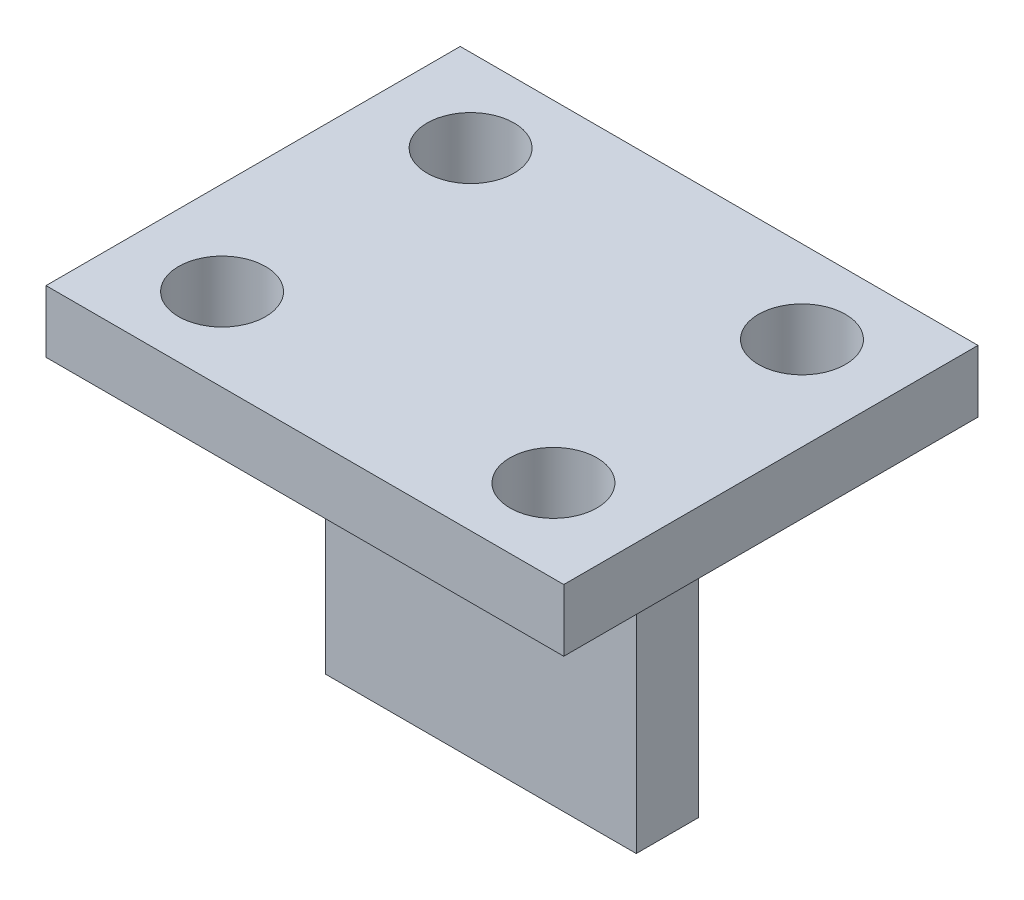
ISO-10303-21;
HEADER;
FILE_DESCRIPTION(('STEP AP214'),'2;1');
FILE_NAME('part.step','',(''),(''),'','','');
FILE_SCHEMA(('AUTOMOTIVE_DESIGN { 1 0 10303 214 1 1 1 1 }'));
ENDSEC;
DATA;
#1=APPLICATION_CONTEXT('core data for automotive mechanical design processes');
#2=APPLICATION_PROTOCOL_DEFINITION('international standard','automotive_design',2000,#1);
#3=PRODUCT_CONTEXT('',#1,'mechanical');
#4=PRODUCT('Part','Part','',(#3));
#5=PRODUCT_RELATED_PRODUCT_CATEGORY('part','',(#4));
#6=PRODUCT_DEFINITION_FORMATION('','',#4);
#7=PRODUCT_DEFINITION_CONTEXT('part definition',#1,'design');
#8=PRODUCT_DEFINITION('design','',#6,#7);
#9=PRODUCT_DEFINITION_SHAPE('','',#8);
#10=(LENGTH_UNIT() NAMED_UNIT(*) SI_UNIT(.MILLI.,.METRE.));
#11=(NAMED_UNIT(*) PLANE_ANGLE_UNIT() SI_UNIT($,.RADIAN.));
#12=(NAMED_UNIT(*) SI_UNIT($,.STERADIAN.) SOLID_ANGLE_UNIT());
#13=UNCERTAINTY_MEASURE_WITH_UNIT(LENGTH_MEASURE(1.E-05),#10,'distance_accuracy_value','');
#14=(GEOMETRIC_REPRESENTATION_CONTEXT(3) GLOBAL_UNCERTAINTY_ASSIGNED_CONTEXT((#13)) GLOBAL_UNIT_ASSIGNED_CONTEXT((#10,
#11,#12)) REPRESENTATION_CONTEXT('',''));
#15=CARTESIAN_POINT('',(0.,0.,0.));
#16=DIRECTION('',(0.,0.,1.));
#17=DIRECTION('',(1.,0.,0.));
#18=AXIS2_PLACEMENT_3D('',#15,#16,#17);
#19=CARTESIAN_POINT('',(12.5,1.5,10.));
#20=DIRECTION('',(-1.,0.,0.));
#21=DIRECTION('',(0.,0.,1.));
#22=AXIS2_PLACEMENT_3D('',#19,#20,#21);
#23=PLANE('',#22);
#24=DIRECTION('',(0.,0.,-1.));
#25=VECTOR('',#24,1.);
#26=CARTESIAN_POINT('',(12.5,-1.5,10.));
#27=LINE('',#26,#25);
#28=CARTESIAN_POINT('',(12.5,-1.5,10.));
#29=VERTEX_POINT('',#28);
#30=CARTESIAN_POINT('',(12.5,-1.5,-10.));
#31=VERTEX_POINT('',#30);
#32=EDGE_CURVE('E120',#29,#31,#27,.T.);
#33=ORIENTED_EDGE('',*,*,#32,.T.);
#34=DIRECTION('',(0.,-1.,0.));
#35=VECTOR('',#34,1.);
#36=CARTESIAN_POINT('',(12.5,1.5,-10.));
#37=LINE('',#36,#35);
#38=CARTESIAN_POINT('',(12.5,1.5,-10.));
#39=VERTEX_POINT('',#38);
#40=EDGE_CURVE('E11',#39,#31,#37,.T.);
#41=ORIENTED_EDGE('',*,*,#40,.F.);
#42=DIRECTION('',(0.,0.,-1.));
#43=VECTOR('',#42,1.);
#44=CARTESIAN_POINT('',(12.5,1.5,10.));
#45=LINE('',#44,#43);
#46=CARTESIAN_POINT('',(12.5,1.5,10.));
#47=VERTEX_POINT('',#46);
#48=EDGE_CURVE('E129',#47,#39,#45,.T.);
#49=ORIENTED_EDGE('',*,*,#48,.F.);
#50=DIRECTION('',(0.,-1.,0.));
#51=VECTOR('',#50,1.);
#52=CARTESIAN_POINT('',(12.5,1.5,10.));
#53=LINE('',#52,#51);
#54=EDGE_CURVE('E138',#47,#29,#53,.T.);
#55=ORIENTED_EDGE('',*,*,#54,.T.);
#56=EDGE_LOOP('',(#33,#41,#49,#55));
#57=FACE_BOUND('',#56,.T.);
#58=ADVANCED_FACE('F36',(#57),#23,.F.);
#59=CARTESIAN_POINT('',(-12.5,1.5,-10.));
#60=DIRECTION('',(0.,0.,1.));
#61=DIRECTION('',(1.,0.,0.));
#62=AXIS2_PLACEMENT_3D('',#59,#60,#61);
#63=PLANE('',#62);
#64=DIRECTION('',(-1.,0.,0.));
#65=VECTOR('',#64,1.);
#66=CARTESIAN_POINT('',(-12.5,-1.5,-10.));
#67=LINE('',#66,#65);
#68=CARTESIAN_POINT('',(-12.5,-1.5,-10.));
#69=VERTEX_POINT('',#68);
#70=EDGE_CURVE('E123',#31,#69,#67,.T.);
#71=ORIENTED_EDGE('',*,*,#70,.T.);
#72=DIRECTION('',(0.,-1.,0.));
#73=VECTOR('',#72,1.);
#74=CARTESIAN_POINT('',(-12.5,1.5,-10.));
#75=LINE('',#74,#73);
#76=CARTESIAN_POINT('',(-12.5,1.5,-10.));
#77=VERTEX_POINT('',#76);
#78=EDGE_CURVE('E43',#77,#69,#75,.T.);
#79=ORIENTED_EDGE('',*,*,#78,.F.);
#80=DIRECTION('',(-1.,0.,0.));
#81=VECTOR('',#80,1.);
#82=CARTESIAN_POINT('',(-12.5,1.5,-10.));
#83=LINE('',#82,#81);
#84=EDGE_CURVE('E132',#39,#77,#83,.T.);
#85=ORIENTED_EDGE('',*,*,#84,.F.);
#86=ORIENTED_EDGE('',*,*,#40,.T.);
#87=EDGE_LOOP('',(#71,#79,#85,#86));
#88=FACE_BOUND('',#87,.T.);
#89=ADVANCED_FACE('F169',(#88),#63,.F.);
#90=CARTESIAN_POINT('',(-12.5,1.5,10.));
#91=DIRECTION('',(1.,0.,0.));
#92=DIRECTION('',(0.,0.,-1.));
#93=AXIS2_PLACEMENT_3D('',#90,#91,#92);
#94=PLANE('',#93);
#95=DIRECTION('',(0.,0.,1.));
#96=VECTOR('',#95,1.);
#97=CARTESIAN_POINT('',(-12.5,-1.5,10.));
#98=LINE('',#97,#96);
#99=CARTESIAN_POINT('',(-12.5,-1.5,10.));
#100=VERTEX_POINT('',#99);
#101=EDGE_CURVE('E141',#69,#100,#98,.T.);
#102=ORIENTED_EDGE('',*,*,#101,.T.);
#103=DIRECTION('',(0.,-1.,0.));
#104=VECTOR('',#103,1.);
#105=CARTESIAN_POINT('',(-12.5,1.5,10.));
#106=LINE('',#105,#104);
#107=CARTESIAN_POINT('',(-12.5,1.5,10.));
#108=VERTEX_POINT('',#107);
#109=EDGE_CURVE('E146',#108,#100,#106,.T.);
#110=ORIENTED_EDGE('',*,*,#109,.F.);
#111=DIRECTION('',(0.,0.,1.));
#112=VECTOR('',#111,1.);
#113=CARTESIAN_POINT('',(-12.5,1.5,10.));
#114=LINE('',#113,#112);
#115=EDGE_CURVE('E135',#77,#108,#114,.T.);
#116=ORIENTED_EDGE('',*,*,#115,.F.);
#117=ORIENTED_EDGE('',*,*,#78,.T.);
#118=EDGE_LOOP('',(#102,#110,#116,#117));
#119=FACE_BOUND('',#118,.T.);
#120=ADVANCED_FACE('F153',(#119),#94,.F.);
#121=CARTESIAN_POINT('',(-12.5,1.5,10.));
#122=DIRECTION('',(0.,0.,-1.));
#123=DIRECTION('',(-1.,0.,0.));
#124=AXIS2_PLACEMENT_3D('',#121,#122,#123);
#125=PLANE('',#124);
#126=DIRECTION('',(1.,0.,0.));
#127=VECTOR('',#126,1.);
#128=CARTESIAN_POINT('',(-12.5,-1.5,10.));
#129=LINE('',#128,#127);
#130=EDGE_CURVE('E133',#100,#29,#129,.T.);
#131=ORIENTED_EDGE('',*,*,#130,.T.);
#132=ORIENTED_EDGE('',*,*,#54,.F.);
#133=DIRECTION('',(1.,0.,0.));
#134=VECTOR('',#133,1.);
#135=CARTESIAN_POINT('',(-12.5,1.5,10.));
#136=LINE('',#135,#134);
#137=EDGE_CURVE('E137',#108,#47,#136,.T.);
#138=ORIENTED_EDGE('',*,*,#137,.F.);
#139=ORIENTED_EDGE('',*,*,#109,.T.);
#140=EDGE_LOOP('',(#131,#132,#138,#139));
#141=FACE_BOUND('',#140,.T.);
#142=ADVANCED_FACE('F162',(#141),#125,.F.);
#143=CARTESIAN_POINT('',(0.,1.5,0.));
#144=DIRECTION('',(0.,-1.,0.));
#145=DIRECTION('',(0.,0.,-1.));
#146=AXIS2_PLACEMENT_3D('',#143,#144,#145);
#147=PLANE('',#146);
#148=CARTESIAN_POINT('',(-8.,1.5,6.));
#149=DIRECTION('',(0.,-1.,0.));
#150=DIRECTION('',(0.,0.,-1.));
#151=AXIS2_PLACEMENT_3D('',#148,#149,#150);
#152=CIRCLE('',#151,2.1);
#153=CARTESIAN_POINT('',(-8.,1.5,3.9));
#154=VERTEX_POINT('',#153);
#155=EDGE_CURVE('E228',#154,#154,#152,.F.);
#156=ORIENTED_EDGE('',*,*,#155,.F.);
#157=EDGE_LOOP('',(#156));
#158=FACE_BOUND('',#157,.T.);
#159=CARTESIAN_POINT('',(8.,1.5,6.));
#160=DIRECTION('',(0.,-1.,0.));
#161=DIRECTION('',(0.,0.,-1.));
#162=AXIS2_PLACEMENT_3D('',#159,#160,#161);
#163=CIRCLE('',#162,2.1);
#164=CARTESIAN_POINT('',(8.,1.5,3.9));
#165=VERTEX_POINT('',#164);
#166=EDGE_CURVE('E224',#165,#165,#163,.F.);
#167=ORIENTED_EDGE('',*,*,#166,.F.);
#168=EDGE_LOOP('',(#167));
#169=FACE_BOUND('',#168,.T.);
#170=CARTESIAN_POINT('',(8.,1.5,-6.));
#171=DIRECTION('',(0.,-1.,0.));
#172=DIRECTION('',(0.,0.,-1.));
#173=AXIS2_PLACEMENT_3D('',#170,#171,#172);
#174=CIRCLE('',#173,2.1);
#175=CARTESIAN_POINT('',(8.,1.5,-8.1));
#176=VERTEX_POINT('',#175);
#177=EDGE_CURVE('E222',#176,#176,#174,.F.);
#178=ORIENTED_EDGE('',*,*,#177,.F.);
#179=EDGE_LOOP('',(#178));
#180=FACE_BOUND('',#179,.T.);
#181=CARTESIAN_POINT('',(-8.,1.5,-6.));
#182=DIRECTION('',(0.,-1.,0.));
#183=DIRECTION('',(0.,0.,-1.));
#184=AXIS2_PLACEMENT_3D('',#181,#182,#183);
#185=CIRCLE('',#184,2.1);
#186=CARTESIAN_POINT('',(-8.,1.5,-8.1));
#187=VERTEX_POINT('',#186);
#188=EDGE_CURVE('E225',#187,#187,#185,.F.);
#189=ORIENTED_EDGE('',*,*,#188,.F.);
#190=EDGE_LOOP('',(#189));
#191=FACE_BOUND('',#190,.T.);
#192=ORIENTED_EDGE('',*,*,#48,.T.);
#193=ORIENTED_EDGE('',*,*,#84,.T.);
#194=ORIENTED_EDGE('',*,*,#115,.T.);
#195=ORIENTED_EDGE('',*,*,#137,.T.);
#196=EDGE_LOOP('',(#192,#193,#194,#195));
#197=FACE_BOUND('',#196,.T.);
#198=ADVANCED_FACE('F168',(#158,#169,#180,#191,#197),#147,.F.);
#199=CARTESIAN_POINT('',(0.,-1.5,0.));
#200=DIRECTION('',(0.,-1.,0.));
#201=DIRECTION('',(0.,0.,-1.));
#202=AXIS2_PLACEMENT_3D('',#199,#200,#201);
#203=PLANE('',#202);
#204=CARTESIAN_POINT('',(-8.,-1.5,6.));
#205=DIRECTION('',(0.,-1.,0.));
#206=DIRECTION('',(0.,0.,-1.));
#207=AXIS2_PLACEMENT_3D('',#204,#205,#206);
#208=CIRCLE('',#207,2.1);
#209=CARTESIAN_POINT('',(-8.,-1.5,3.9));
#210=VERTEX_POINT('',#209);
#211=EDGE_CURVE('E258',#210,#210,#208,.F.);
#212=ORIENTED_EDGE('',*,*,#211,.T.);
#213=EDGE_LOOP('',(#212));
#214=FACE_BOUND('',#213,.T.);
#215=CARTESIAN_POINT('',(8.,-1.5,6.));
#216=DIRECTION('',(0.,-1.,0.));
#217=DIRECTION('',(0.,0.,-1.));
#218=AXIS2_PLACEMENT_3D('',#215,#216,#217);
#219=CIRCLE('',#218,2.1);
#220=CARTESIAN_POINT('',(8.,-1.5,3.9));
#221=VERTEX_POINT('',#220);
#222=EDGE_CURVE('E261',#221,#221,#219,.F.);
#223=ORIENTED_EDGE('',*,*,#222,.T.);
#224=EDGE_LOOP('',(#223));
#225=FACE_BOUND('',#224,.T.);
#226=CARTESIAN_POINT('',(8.,-1.5,-6.));
#227=DIRECTION('',(0.,-1.,0.));
#228=DIRECTION('',(0.,0.,-1.));
#229=AXIS2_PLACEMENT_3D('',#226,#227,#228);
#230=CIRCLE('',#229,2.1);
#231=CARTESIAN_POINT('',(8.,-1.5,-8.1));
#232=VERTEX_POINT('',#231);
#233=EDGE_CURVE('E219',#232,#232,#230,.F.);
#234=ORIENTED_EDGE('',*,*,#233,.T.);
#235=EDGE_LOOP('',(#234));
#236=FACE_BOUND('',#235,.T.);
#237=CARTESIAN_POINT('',(-8.,-1.5,-6.));
#238=DIRECTION('',(0.,-1.,0.));
#239=DIRECTION('',(0.,0.,-1.));
#240=AXIS2_PLACEMENT_3D('',#237,#238,#239);
#241=CIRCLE('',#240,2.1);
#242=CARTESIAN_POINT('',(-8.,-1.5,-8.1));
#243=VERTEX_POINT('',#242);
#244=EDGE_CURVE('E231',#243,#243,#241,.F.);
#245=ORIENTED_EDGE('',*,*,#244,.T.);
#246=EDGE_LOOP('',(#245));
#247=FACE_BOUND('',#246,.T.);
#248=DIRECTION('',(0.,0.,1.));
#249=VECTOR('',#248,1.);
#250=CARTESIAN_POINT('',(7.5,-1.5,-1.5));
#251=LINE('',#250,#249);
#252=CARTESIAN_POINT('',(7.5,-1.5,-1.5));
#253=VERTEX_POINT('',#252);
#254=CARTESIAN_POINT('',(7.5,-1.5,1.5));
#255=VERTEX_POINT('',#254);
#256=EDGE_CURVE('E50',#253,#255,#251,.T.);
#257=ORIENTED_EDGE('',*,*,#256,.F.);
#258=DIRECTION('',(1.,0.,0.));
#259=VECTOR('',#258,1.);
#260=CARTESIAN_POINT('',(-7.5,-1.5,-1.5));
#261=LINE('',#260,#259);
#262=CARTESIAN_POINT('',(-7.5,-1.5,-1.5));
#263=VERTEX_POINT('',#262);
#264=EDGE_CURVE('E54',#263,#253,#261,.T.);
#265=ORIENTED_EDGE('',*,*,#264,.F.);
#266=DIRECTION('',(0.,0.,-1.));
#267=VECTOR('',#266,1.);
#268=CARTESIAN_POINT('',(-7.5,-1.5,-1.5));
#269=LINE('',#268,#267);
#270=CARTESIAN_POINT('',(-7.5,-1.5,1.5));
#271=VERTEX_POINT('',#270);
#272=EDGE_CURVE('E243',#271,#263,#269,.T.);
#273=ORIENTED_EDGE('',*,*,#272,.F.);
#274=DIRECTION('',(-1.,0.,0.));
#275=VECTOR('',#274,1.);
#276=CARTESIAN_POINT('',(-7.5,-1.5,1.5));
#277=LINE('',#276,#275);
#278=EDGE_CURVE('E241',#255,#271,#277,.T.);
#279=ORIENTED_EDGE('',*,*,#278,.F.);
#280=EDGE_LOOP('',(#257,#265,#273,#279));
#281=FACE_BOUND('',#280,.T.);
#282=ORIENTED_EDGE('',*,*,#32,.F.);
#283=ORIENTED_EDGE('',*,*,#130,.F.);
#284=ORIENTED_EDGE('',*,*,#101,.F.);
#285=ORIENTED_EDGE('',*,*,#70,.F.);
#286=EDGE_LOOP('',(#282,#283,#284,#285));
#287=FACE_BOUND('',#286,.T.);
#288=ADVANCED_FACE('F159',(#214,#225,#236,#247,#281,#287),#203,.T.);
#289=CARTESIAN_POINT('',(7.5,-16.5,-1.5));
#290=DIRECTION('',(-1.,0.,0.));
#291=DIRECTION('',(0.,0.,1.));
#292=AXIS2_PLACEMENT_3D('',#289,#290,#291);
#293=PLANE('',#292);
#294=ORIENTED_EDGE('',*,*,#256,.T.);
#295=DIRECTION('',(0.,1.,0.));
#296=VECTOR('',#295,1.);
#297=CARTESIAN_POINT('',(7.5,-16.5,1.5));
#298=LINE('',#297,#296);
#299=CARTESIAN_POINT('',(7.5,-16.5,1.5));
#300=VERTEX_POINT('',#299);
#301=EDGE_CURVE('E103',#300,#255,#298,.T.);
#302=ORIENTED_EDGE('',*,*,#301,.F.);
#303=DIRECTION('',(0.,0.,1.));
#304=VECTOR('',#303,1.);
#305=CARTESIAN_POINT('',(7.5,-16.5,-1.5));
#306=LINE('',#305,#304);
#307=CARTESIAN_POINT('',(7.5,-16.5,-1.5));
#308=VERTEX_POINT('',#307);
#309=EDGE_CURVE('E109',#308,#300,#306,.T.);
#310=ORIENTED_EDGE('',*,*,#309,.F.);
#311=DIRECTION('',(0.,1.,0.));
#312=VECTOR('',#311,1.);
#313=CARTESIAN_POINT('',(7.5,-16.5,-1.5));
#314=LINE('',#313,#312);
#315=EDGE_CURVE('E239',#308,#253,#314,.T.);
#316=ORIENTED_EDGE('',*,*,#315,.T.);
#317=EDGE_LOOP('',(#294,#302,#310,#316));
#318=FACE_BOUND('',#317,.T.);
#319=ADVANCED_FACE('F119',(#318),#293,.F.);
#320=CARTESIAN_POINT('',(-7.5,-16.5,1.5));
#321=DIRECTION('',(0.,0.,-1.));
#322=DIRECTION('',(-1.,0.,0.));
#323=AXIS2_PLACEMENT_3D('',#320,#321,#322);
#324=PLANE('',#323);
#325=ORIENTED_EDGE('',*,*,#278,.T.);
#326=DIRECTION('',(0.,1.,0.));
#327=VECTOR('',#326,1.);
#328=CARTESIAN_POINT('',(-7.5,-16.5,1.5));
#329=LINE('',#328,#327);
#330=CARTESIAN_POINT('',(-7.5,-16.5,1.5));
#331=VERTEX_POINT('',#330);
#332=EDGE_CURVE('E105',#331,#271,#329,.T.);
#333=ORIENTED_EDGE('',*,*,#332,.F.);
#334=DIRECTION('',(-1.,0.,0.));
#335=VECTOR('',#334,1.);
#336=CARTESIAN_POINT('',(-7.5,-16.5,1.5));
#337=LINE('',#336,#335);
#338=EDGE_CURVE('E98',#300,#331,#337,.T.);
#339=ORIENTED_EDGE('',*,*,#338,.F.);
#340=ORIENTED_EDGE('',*,*,#301,.T.);
#341=EDGE_LOOP('',(#325,#333,#339,#340));
#342=FACE_BOUND('',#341,.T.);
#343=ADVANCED_FACE('F101',(#342),#324,.F.);
#344=CARTESIAN_POINT('',(-7.5,-16.5,-1.5));
#345=DIRECTION('',(1.,0.,0.));
#346=DIRECTION('',(0.,0.,-1.));
#347=AXIS2_PLACEMENT_3D('',#344,#345,#346);
#348=PLANE('',#347);
#349=ORIENTED_EDGE('',*,*,#272,.T.);
#350=DIRECTION('',(0.,1.,0.));
#351=VECTOR('',#350,1.);
#352=CARTESIAN_POINT('',(-7.5,-16.5,-1.5));
#353=LINE('',#352,#351);
#354=CARTESIAN_POINT('',(-7.5,-16.5,-1.5));
#355=VERTEX_POINT('',#354);
#356=EDGE_CURVE('E125',#355,#263,#353,.T.);
#357=ORIENTED_EDGE('',*,*,#356,.F.);
#358=DIRECTION('',(0.,0.,-1.));
#359=VECTOR('',#358,1.);
#360=CARTESIAN_POINT('',(-7.5,-16.5,-1.5));
#361=LINE('',#360,#359);
#362=EDGE_CURVE('E108',#331,#355,#361,.T.);
#363=ORIENTED_EDGE('',*,*,#362,.F.);
#364=ORIENTED_EDGE('',*,*,#332,.T.);
#365=EDGE_LOOP('',(#349,#357,#363,#364));
#366=FACE_BOUND('',#365,.T.);
#367=ADVANCED_FACE('F189',(#366),#348,.F.);
#368=CARTESIAN_POINT('',(-7.5,-16.5,-1.5));
#369=DIRECTION('',(0.,0.,1.));
#370=DIRECTION('',(1.,0.,0.));
#371=AXIS2_PLACEMENT_3D('',#368,#369,#370);
#372=PLANE('',#371);
#373=ORIENTED_EDGE('',*,*,#264,.T.);
#374=ORIENTED_EDGE('',*,*,#315,.F.);
#375=DIRECTION('',(1.,0.,0.));
#376=VECTOR('',#375,1.);
#377=CARTESIAN_POINT('',(-7.5,-16.5,-1.5));
#378=LINE('',#377,#376);
#379=EDGE_CURVE('E114',#355,#308,#378,.T.);
#380=ORIENTED_EDGE('',*,*,#379,.F.);
#381=ORIENTED_EDGE('',*,*,#356,.T.);
#382=EDGE_LOOP('',(#373,#374,#380,#381));
#383=FACE_BOUND('',#382,.T.);
#384=ADVANCED_FACE('F192',(#383),#372,.F.);
#385=CARTESIAN_POINT('',(0.,-16.5,0.));
#386=DIRECTION('',(0.,1.,0.));
#387=DIRECTION('',(0.,0.,1.));
#388=AXIS2_PLACEMENT_3D('',#385,#386,#387);
#389=PLANE('',#388);
#390=ORIENTED_EDGE('',*,*,#309,.T.);
#391=ORIENTED_EDGE('',*,*,#338,.T.);
#392=ORIENTED_EDGE('',*,*,#362,.T.);
#393=ORIENTED_EDGE('',*,*,#379,.T.);
#394=EDGE_LOOP('',(#390,#391,#392,#393));
#395=FACE_BOUND('',#394,.T.);
#396=ADVANCED_FACE('F112',(#395),#389,.F.);
#397=CARTESIAN_POINT('',(-8.,1.500012,-6.));
#398=DIRECTION('',(0.,-1.,0.));
#399=DIRECTION('',(0.,0.,-1.));
#400=AXIS2_PLACEMENT_3D('',#397,#398,#399);
#401=CYLINDRICAL_SURFACE('',#400,2.1);
#402=CARTESIAN_POINT('',(-8.,-1.5,-8.1));
#403=CARTESIAN_POINT('',(-8.,-1.46875,-8.1));
#404=CARTESIAN_POINT('',(-8.,-1.4375,-8.1));
#405=CARTESIAN_POINT('',(-8.,-1.375,-8.1));
#406=CARTESIAN_POINT('',(-8.,-1.34375,-8.1));
#407=CARTESIAN_POINT('',(-8.,-1.28125,-8.1));
#408=CARTESIAN_POINT('',(-8.,-1.25,-8.1));
#409=CARTESIAN_POINT('',(-8.,-1.1875,-8.1));
#410=CARTESIAN_POINT('',(-8.,-1.15625,-8.1));
#411=CARTESIAN_POINT('',(-8.,-1.09375,-8.1));
#412=CARTESIAN_POINT('',(-8.,-1.0625,-8.1));
#413=CARTESIAN_POINT('',(-8.,-0.999999999999999,-8.1));
#414=CARTESIAN_POINT('',(-8.,-0.968749999999999,-8.1));
#415=CARTESIAN_POINT('',(-8.,-0.906249999999999,-8.1));
#416=CARTESIAN_POINT('',(-8.,-0.874999999999999,-8.1));
#417=CARTESIAN_POINT('',(-8.,-0.812499999999999,-8.1));
#418=CARTESIAN_POINT('',(-8.,-0.78125,-8.1));
#419=CARTESIAN_POINT('',(-8.,-0.71875,-8.1));
#420=CARTESIAN_POINT('',(-8.,-0.6875,-8.1));
#421=CARTESIAN_POINT('',(-8.,-0.624999999999999,-8.1));
#422=CARTESIAN_POINT('',(-8.,-0.593749999999999,-8.1));
#423=CARTESIAN_POINT('',(-8.,-0.531249999999999,-8.1));
#424=CARTESIAN_POINT('',(-8.,-0.499999999999999,-8.1));
#425=CARTESIAN_POINT('',(-8.,-0.437499999999999,-8.1));
#426=CARTESIAN_POINT('',(-8.,-0.406249999999999,-8.1));
#427=CARTESIAN_POINT('',(-8.,-0.34375,-8.1));
#428=CARTESIAN_POINT('',(-8.,-0.3125,-8.1));
#429=CARTESIAN_POINT('',(-8.,-0.25,-8.1));
#430=CARTESIAN_POINT('',(-8.,-0.21875,-8.1));
#431=CARTESIAN_POINT('',(-8.,-0.15625,-8.1));
#432=CARTESIAN_POINT('',(-8.,-0.125,-8.1));
#433=CARTESIAN_POINT('',(-8.,-0.0624999999999996,-8.1));
#434=CARTESIAN_POINT('',(-8.,-0.0312499999999996,-8.1));
#435=CARTESIAN_POINT('',(-8.,0.0312500000000005,-8.1));
#436=CARTESIAN_POINT('',(-8.,0.0625000000000005,-8.1));
#437=CARTESIAN_POINT('',(-8.,0.125,-8.1));
#438=CARTESIAN_POINT('',(-8.,0.15625,-8.1));
#439=CARTESIAN_POINT('',(-8.,0.21875,-8.1));
#440=CARTESIAN_POINT('',(-8.,0.25,-8.1));
#441=CARTESIAN_POINT('',(-8.,0.3125,-8.1));
#442=CARTESIAN_POINT('',(-8.,0.34375,-8.1));
#443=CARTESIAN_POINT('',(-8.,0.40625,-8.1));
#444=CARTESIAN_POINT('',(-8.,0.4375,-8.1));
#445=CARTESIAN_POINT('',(-8.,0.5,-8.1));
#446=CARTESIAN_POINT('',(-8.,0.53125,-8.1));
#447=CARTESIAN_POINT('',(-8.,0.59375,-8.1));
#448=CARTESIAN_POINT('',(-8.,0.625,-8.1));
#449=CARTESIAN_POINT('',(-8.,0.687500000000001,-8.1));
#450=CARTESIAN_POINT('',(-8.,0.718750000000001,-8.1));
#451=CARTESIAN_POINT('',(-8.,0.78125,-8.1));
#452=CARTESIAN_POINT('',(-8.,0.8125,-8.1));
#453=CARTESIAN_POINT('',(-8.,0.875,-8.1));
#454=CARTESIAN_POINT('',(-8.,0.90625,-8.1));
#455=CARTESIAN_POINT('',(-8.,0.96875,-8.1));
#456=CARTESIAN_POINT('',(-8.,1.,-8.1));
#457=CARTESIAN_POINT('',(-8.,1.0625,-8.1));
#458=CARTESIAN_POINT('',(-8.,1.09375,-8.1));
#459=CARTESIAN_POINT('',(-8.,1.15625,-8.1));
#460=CARTESIAN_POINT('',(-8.,1.1875,-8.1));
#461=CARTESIAN_POINT('',(-8.,1.25,-8.1));
#462=CARTESIAN_POINT('',(-8.,1.28125,-8.1));
#463=CARTESIAN_POINT('',(-8.,1.34375,-8.1));
#464=CARTESIAN_POINT('',(-8.,1.375,-8.1));
#465=CARTESIAN_POINT('',(-8.,1.4375,-8.1));
#466=CARTESIAN_POINT('',(-8.,1.46875,-8.1));
#467=CARTESIAN_POINT('',(-8.,1.5,-8.1));
#468=B_SPLINE_CURVE_WITH_KNOTS('',3,(#402,#403,#404,#405,#406,#407,#408,#409,#410,#411,#412,
#413,#414,#415,#416,#417,#418,#419,#420,#421,#422,#423,#424,#425,#426,#427,#428,#429,#430,#431,
#432,#433,#434,#435,#436,#437,#438,#439,#440,#441,#442,#443,#444,#445,#446,#447,#448,#449,#450,
#451,#452,#453,#454,#455,#456,#457,#458,#459,#460,#461,#462,#463,#464,#465,#466,#467),
.UNSPECIFIED.,.F.,.F.,(4,2,2,2,2,2,2,2,2,2,2,2,2,2,2,2,2,2,2,2,2,2,2,2,2,2,2,2,2,2,2,2,4),(0.,
0.0937500000000001,0.1875,0.28125,0.375,0.46875,0.5625,0.65625,0.75,0.84375,0.9375,1.03125,
1.125,1.21875,1.3125,1.40625,1.5,1.59375,1.6875,1.78125,1.875,1.96875,2.0625,2.15625,2.25,
2.34375,2.4375,2.53125,2.625,2.71875,2.8125,2.90625,3.),.UNSPECIFIED.);
#469=EDGE_CURVE('BSEAM199',#243,#187,#468,.T.);
#470=ORIENTED_EDGE('',*,*,#244,.F.);
#471=ORIENTED_EDGE('',*,*,#188,.T.);
#472=ORIENTED_EDGE('',*,*,#469,.T.);
#473=ORIENTED_EDGE('',*,*,#469,.F.);
#474=EDGE_LOOP('',(#470,#472,#471,#473));
#475=FACE_BOUND('',#474,.T.);
#476=ADVANCED_FACE('F199',(#475),#401,.F.);
#477=CARTESIAN_POINT('',(8.,1.500012,-6.));
#478=DIRECTION('',(0.,-1.,0.));
#479=DIRECTION('',(0.,0.,-1.));
#480=AXIS2_PLACEMENT_3D('',#477,#478,#479);
#481=CYLINDRICAL_SURFACE('',#480,2.1);
#482=CARTESIAN_POINT('',(8.,-1.5,-8.1));
#483=CARTESIAN_POINT('',(8.,-1.46875,-8.1));
#484=CARTESIAN_POINT('',(8.,-1.4375,-8.1));
#485=CARTESIAN_POINT('',(8.,-1.375,-8.1));
#486=CARTESIAN_POINT('',(8.,-1.34375,-8.1));
#487=CARTESIAN_POINT('',(8.,-1.28125,-8.1));
#488=CARTESIAN_POINT('',(8.,-1.25,-8.1));
#489=CARTESIAN_POINT('',(8.,-1.1875,-8.1));
#490=CARTESIAN_POINT('',(8.,-1.15625,-8.1));
#491=CARTESIAN_POINT('',(8.,-1.09375,-8.1));
#492=CARTESIAN_POINT('',(8.,-1.0625,-8.1));
#493=CARTESIAN_POINT('',(8.,-0.999999999999999,-8.1));
#494=CARTESIAN_POINT('',(8.,-0.968749999999999,-8.1));
#495=CARTESIAN_POINT('',(8.,-0.906249999999999,-8.1));
#496=CARTESIAN_POINT('',(8.,-0.874999999999999,-8.1));
#497=CARTESIAN_POINT('',(8.,-0.812499999999999,-8.1));
#498=CARTESIAN_POINT('',(8.,-0.78125,-8.1));
#499=CARTESIAN_POINT('',(8.,-0.71875,-8.1));
#500=CARTESIAN_POINT('',(8.,-0.6875,-8.1));
#501=CARTESIAN_POINT('',(8.,-0.624999999999999,-8.1));
#502=CARTESIAN_POINT('',(8.,-0.593749999999999,-8.1));
#503=CARTESIAN_POINT('',(8.,-0.531249999999999,-8.1));
#504=CARTESIAN_POINT('',(8.,-0.499999999999999,-8.1));
#505=CARTESIAN_POINT('',(8.,-0.437499999999999,-8.1));
#506=CARTESIAN_POINT('',(8.,-0.406249999999999,-8.1));
#507=CARTESIAN_POINT('',(8.,-0.34375,-8.1));
#508=CARTESIAN_POINT('',(8.,-0.3125,-8.1));
#509=CARTESIAN_POINT('',(8.,-0.25,-8.1));
#510=CARTESIAN_POINT('',(8.,-0.21875,-8.1));
#511=CARTESIAN_POINT('',(8.,-0.15625,-8.1));
#512=CARTESIAN_POINT('',(8.,-0.125,-8.1));
#513=CARTESIAN_POINT('',(8.,-0.0624999999999996,-8.1));
#514=CARTESIAN_POINT('',(8.,-0.0312499999999996,-8.1));
#515=CARTESIAN_POINT('',(8.,0.0312500000000005,-8.1));
#516=CARTESIAN_POINT('',(8.,0.0625000000000005,-8.1));
#517=CARTESIAN_POINT('',(8.,0.125,-8.1));
#518=CARTESIAN_POINT('',(8.,0.15625,-8.1));
#519=CARTESIAN_POINT('',(8.,0.21875,-8.1));
#520=CARTESIAN_POINT('',(8.,0.25,-8.1));
#521=CARTESIAN_POINT('',(8.,0.3125,-8.1));
#522=CARTESIAN_POINT('',(8.,0.34375,-8.1));
#523=CARTESIAN_POINT('',(8.,0.40625,-8.1));
#524=CARTESIAN_POINT('',(8.,0.4375,-8.1));
#525=CARTESIAN_POINT('',(8.,0.5,-8.1));
#526=CARTESIAN_POINT('',(8.,0.53125,-8.1));
#527=CARTESIAN_POINT('',(8.,0.59375,-8.1));
#528=CARTESIAN_POINT('',(8.,0.625,-8.1));
#529=CARTESIAN_POINT('',(8.,0.687500000000001,-8.1));
#530=CARTESIAN_POINT('',(8.,0.718750000000001,-8.1));
#531=CARTESIAN_POINT('',(8.,0.78125,-8.1));
#532=CARTESIAN_POINT('',(8.,0.8125,-8.1));
#533=CARTESIAN_POINT('',(8.,0.875,-8.1));
#534=CARTESIAN_POINT('',(8.,0.90625,-8.1));
#535=CARTESIAN_POINT('',(8.,0.96875,-8.1));
#536=CARTESIAN_POINT('',(8.,1.,-8.1));
#537=CARTESIAN_POINT('',(8.,1.0625,-8.1));
#538=CARTESIAN_POINT('',(8.,1.09375,-8.1));
#539=CARTESIAN_POINT('',(8.,1.15625,-8.1));
#540=CARTESIAN_POINT('',(8.,1.1875,-8.1));
#541=CARTESIAN_POINT('',(8.,1.25,-8.1));
#542=CARTESIAN_POINT('',(8.,1.28125,-8.1));
#543=CARTESIAN_POINT('',(8.,1.34375,-8.1));
#544=CARTESIAN_POINT('',(8.,1.375,-8.1));
#545=CARTESIAN_POINT('',(8.,1.4375,-8.1));
#546=CARTESIAN_POINT('',(8.,1.46875,-8.1));
#547=CARTESIAN_POINT('',(8.,1.5,-8.1));
#548=B_SPLINE_CURVE_WITH_KNOTS('',3,(#482,#483,#484,#485,#486,#487,#488,#489,#490,#491,#492,
#493,#494,#495,#496,#497,#498,#499,#500,#501,#502,#503,#504,#505,#506,#507,#508,#509,#510,#511,
#512,#513,#514,#515,#516,#517,#518,#519,#520,#521,#522,#523,#524,#525,#526,#527,#528,#529,#530,
#531,#532,#533,#534,#535,#536,#537,#538,#539,#540,#541,#542,#543,#544,#545,#546,#547),
.UNSPECIFIED.,.F.,.F.,(4,2,2,2,2,2,2,2,2,2,2,2,2,2,2,2,2,2,2,2,2,2,2,2,2,2,2,2,2,2,2,2,4),(0.,
0.0937500000000001,0.1875,0.28125,0.375,0.46875,0.5625,0.65625,0.75,0.84375,0.9375,1.03125,
1.125,1.21875,1.3125,1.40625,1.5,1.59375,1.6875,1.78125,1.875,1.96875,2.0625,2.15625,2.25,
2.34375,2.4375,2.53125,2.625,2.71875,2.8125,2.90625,3.),.UNSPECIFIED.);
#549=EDGE_CURVE('BSEAM202',#232,#176,#548,.T.);
#550=ORIENTED_EDGE('',*,*,#233,.F.);
#551=ORIENTED_EDGE('',*,*,#177,.T.);
#552=ORIENTED_EDGE('',*,*,#549,.T.);
#553=ORIENTED_EDGE('',*,*,#549,.F.);
#554=EDGE_LOOP('',(#550,#552,#551,#553));
#555=FACE_BOUND('',#554,.T.);
#556=ADVANCED_FACE('F202',(#555),#481,.F.);
#557=CARTESIAN_POINT('',(8.,1.500012,6.));
#558=DIRECTION('',(0.,-1.,0.));
#559=DIRECTION('',(0.,0.,-1.));
#560=AXIS2_PLACEMENT_3D('',#557,#558,#559);
#561=CYLINDRICAL_SURFACE('',#560,2.1);
#562=CARTESIAN_POINT('',(8.,-1.5,3.9));
#563=CARTESIAN_POINT('',(8.,-1.46875,3.9));
#564=CARTESIAN_POINT('',(8.,-1.4375,3.9));
#565=CARTESIAN_POINT('',(8.,-1.375,3.9));
#566=CARTESIAN_POINT('',(8.,-1.34375,3.9));
#567=CARTESIAN_POINT('',(8.,-1.28125,3.9));
#568=CARTESIAN_POINT('',(8.,-1.25,3.9));
#569=CARTESIAN_POINT('',(8.,-1.1875,3.9));
#570=CARTESIAN_POINT('',(8.,-1.15625,3.9));
#571=CARTESIAN_POINT('',(8.,-1.09375,3.9));
#572=CARTESIAN_POINT('',(8.,-1.0625,3.9));
#573=CARTESIAN_POINT('',(8.,-0.999999999999999,3.9));
#574=CARTESIAN_POINT('',(8.,-0.968749999999999,3.9));
#575=CARTESIAN_POINT('',(8.,-0.906249999999999,3.9));
#576=CARTESIAN_POINT('',(8.,-0.874999999999999,3.9));
#577=CARTESIAN_POINT('',(8.,-0.812499999999999,3.9));
#578=CARTESIAN_POINT('',(8.,-0.78125,3.9));
#579=CARTESIAN_POINT('',(8.,-0.71875,3.9));
#580=CARTESIAN_POINT('',(8.,-0.6875,3.9));
#581=CARTESIAN_POINT('',(8.,-0.624999999999999,3.9));
#582=CARTESIAN_POINT('',(8.,-0.593749999999999,3.9));
#583=CARTESIAN_POINT('',(8.,-0.531249999999999,3.9));
#584=CARTESIAN_POINT('',(8.,-0.499999999999999,3.9));
#585=CARTESIAN_POINT('',(8.,-0.437499999999999,3.9));
#586=CARTESIAN_POINT('',(8.,-0.406249999999999,3.9));
#587=CARTESIAN_POINT('',(8.,-0.34375,3.9));
#588=CARTESIAN_POINT('',(8.,-0.3125,3.9));
#589=CARTESIAN_POINT('',(8.,-0.25,3.9));
#590=CARTESIAN_POINT('',(8.,-0.21875,3.9));
#591=CARTESIAN_POINT('',(8.,-0.15625,3.9));
#592=CARTESIAN_POINT('',(8.,-0.125,3.9));
#593=CARTESIAN_POINT('',(8.,-0.0624999999999996,3.9));
#594=CARTESIAN_POINT('',(8.,-0.0312499999999996,3.9));
#595=CARTESIAN_POINT('',(8.,0.0312500000000005,3.9));
#596=CARTESIAN_POINT('',(8.,0.0625000000000005,3.9));
#597=CARTESIAN_POINT('',(8.,0.125,3.9));
#598=CARTESIAN_POINT('',(8.,0.15625,3.9));
#599=CARTESIAN_POINT('',(8.,0.21875,3.9));
#600=CARTESIAN_POINT('',(8.,0.25,3.9));
#601=CARTESIAN_POINT('',(8.,0.3125,3.9));
#602=CARTESIAN_POINT('',(8.,0.34375,3.9));
#603=CARTESIAN_POINT('',(8.,0.40625,3.9));
#604=CARTESIAN_POINT('',(8.,0.4375,3.9));
#605=CARTESIAN_POINT('',(8.,0.5,3.9));
#606=CARTESIAN_POINT('',(8.,0.53125,3.9));
#607=CARTESIAN_POINT('',(8.,0.59375,3.9));
#608=CARTESIAN_POINT('',(8.,0.625,3.9));
#609=CARTESIAN_POINT('',(8.,0.687500000000001,3.9));
#610=CARTESIAN_POINT('',(8.,0.718750000000001,3.9));
#611=CARTESIAN_POINT('',(8.,0.78125,3.9));
#612=CARTESIAN_POINT('',(8.,0.8125,3.9));
#613=CARTESIAN_POINT('',(8.,0.875,3.9));
#614=CARTESIAN_POINT('',(8.,0.90625,3.9));
#615=CARTESIAN_POINT('',(8.,0.96875,3.9));
#616=CARTESIAN_POINT('',(8.,1.,3.9));
#617=CARTESIAN_POINT('',(8.,1.0625,3.9));
#618=CARTESIAN_POINT('',(8.,1.09375,3.9));
#619=CARTESIAN_POINT('',(8.,1.15625,3.9));
#620=CARTESIAN_POINT('',(8.,1.1875,3.9));
#621=CARTESIAN_POINT('',(8.,1.25,3.9));
#622=CARTESIAN_POINT('',(8.,1.28125,3.9));
#623=CARTESIAN_POINT('',(8.,1.34375,3.9));
#624=CARTESIAN_POINT('',(8.,1.375,3.9));
#625=CARTESIAN_POINT('',(8.,1.4375,3.9));
#626=CARTESIAN_POINT('',(8.,1.46875,3.9));
#627=CARTESIAN_POINT('',(8.,1.5,3.9));
#628=B_SPLINE_CURVE_WITH_KNOTS('',3,(#562,#563,#564,#565,#566,#567,#568,#569,#570,#571,#572,
#573,#574,#575,#576,#577,#578,#579,#580,#581,#582,#583,#584,#585,#586,#587,#588,#589,#590,#591,
#592,#593,#594,#595,#596,#597,#598,#599,#600,#601,#602,#603,#604,#605,#606,#607,#608,#609,#610,
#611,#612,#613,#614,#615,#616,#617,#618,#619,#620,#621,#622,#623,#624,#625,#626,#627),
.UNSPECIFIED.,.F.,.F.,(4,2,2,2,2,2,2,2,2,2,2,2,2,2,2,2,2,2,2,2,2,2,2,2,2,2,2,2,2,2,2,2,4),(0.,
0.0937500000000001,0.1875,0.28125,0.375,0.46875,0.5625,0.65625,0.75,0.84375,0.9375,1.03125,
1.125,1.21875,1.3125,1.40625,1.5,1.59375,1.6875,1.78125,1.875,1.96875,2.0625,2.15625,2.25,
2.34375,2.4375,2.53125,2.625,2.71875,2.8125,2.90625,3.),.UNSPECIFIED.);
#629=EDGE_CURVE('BSEAM207',#221,#165,#628,.T.);
#630=ORIENTED_EDGE('',*,*,#222,.F.);
#631=ORIENTED_EDGE('',*,*,#166,.T.);
#632=ORIENTED_EDGE('',*,*,#629,.T.);
#633=ORIENTED_EDGE('',*,*,#629,.F.);
#634=EDGE_LOOP('',(#630,#632,#631,#633));
#635=FACE_BOUND('',#634,.T.);
#636=ADVANCED_FACE('F207',(#635),#561,.F.);
#637=CARTESIAN_POINT('',(-8.,1.500012,6.));
#638=DIRECTION('',(0.,-1.,0.));
#639=DIRECTION('',(0.,0.,-1.));
#640=AXIS2_PLACEMENT_3D('',#637,#638,#639);
#641=CYLINDRICAL_SURFACE('',#640,2.1);
#642=CARTESIAN_POINT('',(-8.,-1.5,3.9));
#643=CARTESIAN_POINT('',(-8.,-1.46875,3.9));
#644=CARTESIAN_POINT('',(-8.,-1.4375,3.9));
#645=CARTESIAN_POINT('',(-8.,-1.375,3.9));
#646=CARTESIAN_POINT('',(-8.,-1.34375,3.9));
#647=CARTESIAN_POINT('',(-8.,-1.28125,3.9));
#648=CARTESIAN_POINT('',(-8.,-1.25,3.9));
#649=CARTESIAN_POINT('',(-8.,-1.1875,3.9));
#650=CARTESIAN_POINT('',(-8.,-1.15625,3.9));
#651=CARTESIAN_POINT('',(-8.,-1.09375,3.9));
#652=CARTESIAN_POINT('',(-8.,-1.0625,3.9));
#653=CARTESIAN_POINT('',(-8.,-0.999999999999999,3.9));
#654=CARTESIAN_POINT('',(-8.,-0.968749999999999,3.9));
#655=CARTESIAN_POINT('',(-8.,-0.906249999999999,3.9));
#656=CARTESIAN_POINT('',(-8.,-0.874999999999999,3.9));
#657=CARTESIAN_POINT('',(-8.,-0.812499999999999,3.9));
#658=CARTESIAN_POINT('',(-8.,-0.78125,3.9));
#659=CARTESIAN_POINT('',(-8.,-0.71875,3.9));
#660=CARTESIAN_POINT('',(-8.,-0.6875,3.9));
#661=CARTESIAN_POINT('',(-8.,-0.624999999999999,3.9));
#662=CARTESIAN_POINT('',(-8.,-0.593749999999999,3.9));
#663=CARTESIAN_POINT('',(-8.,-0.531249999999999,3.9));
#664=CARTESIAN_POINT('',(-8.,-0.499999999999999,3.9));
#665=CARTESIAN_POINT('',(-8.,-0.437499999999999,3.9));
#666=CARTESIAN_POINT('',(-8.,-0.406249999999999,3.9));
#667=CARTESIAN_POINT('',(-8.,-0.34375,3.9));
#668=CARTESIAN_POINT('',(-8.,-0.3125,3.9));
#669=CARTESIAN_POINT('',(-8.,-0.25,3.9));
#670=CARTESIAN_POINT('',(-8.,-0.21875,3.9));
#671=CARTESIAN_POINT('',(-8.,-0.15625,3.9));
#672=CARTESIAN_POINT('',(-8.,-0.125,3.9));
#673=CARTESIAN_POINT('',(-8.,-0.0624999999999996,3.9));
#674=CARTESIAN_POINT('',(-8.,-0.0312499999999996,3.9));
#675=CARTESIAN_POINT('',(-8.,0.0312500000000005,3.9));
#676=CARTESIAN_POINT('',(-8.,0.0625000000000005,3.9));
#677=CARTESIAN_POINT('',(-8.,0.125,3.9));
#678=CARTESIAN_POINT('',(-8.,0.15625,3.9));
#679=CARTESIAN_POINT('',(-8.,0.21875,3.9));
#680=CARTESIAN_POINT('',(-8.,0.25,3.9));
#681=CARTESIAN_POINT('',(-8.,0.3125,3.9));
#682=CARTESIAN_POINT('',(-8.,0.34375,3.9));
#683=CARTESIAN_POINT('',(-8.,0.40625,3.9));
#684=CARTESIAN_POINT('',(-8.,0.4375,3.9));
#685=CARTESIAN_POINT('',(-8.,0.5,3.9));
#686=CARTESIAN_POINT('',(-8.,0.53125,3.9));
#687=CARTESIAN_POINT('',(-8.,0.59375,3.9));
#688=CARTESIAN_POINT('',(-8.,0.625,3.9));
#689=CARTESIAN_POINT('',(-8.,0.687500000000001,3.9));
#690=CARTESIAN_POINT('',(-8.,0.718750000000001,3.9));
#691=CARTESIAN_POINT('',(-8.,0.78125,3.9));
#692=CARTESIAN_POINT('',(-8.,0.8125,3.9));
#693=CARTESIAN_POINT('',(-8.,0.875,3.9));
#694=CARTESIAN_POINT('',(-8.,0.90625,3.9));
#695=CARTESIAN_POINT('',(-8.,0.96875,3.9));
#696=CARTESIAN_POINT('',(-8.,1.,3.9));
#697=CARTESIAN_POINT('',(-8.,1.0625,3.9));
#698=CARTESIAN_POINT('',(-8.,1.09375,3.9));
#699=CARTESIAN_POINT('',(-8.,1.15625,3.9));
#700=CARTESIAN_POINT('',(-8.,1.1875,3.9));
#701=CARTESIAN_POINT('',(-8.,1.25,3.9));
#702=CARTESIAN_POINT('',(-8.,1.28125,3.9));
#703=CARTESIAN_POINT('',(-8.,1.34375,3.9));
#704=CARTESIAN_POINT('',(-8.,1.375,3.9));
#705=CARTESIAN_POINT('',(-8.,1.4375,3.9));
#706=CARTESIAN_POINT('',(-8.,1.46875,3.9));
#707=CARTESIAN_POINT('',(-8.,1.5,3.9));
#708=B_SPLINE_CURVE_WITH_KNOTS('',3,(#642,#643,#644,#645,#646,#647,#648,#649,#650,#651,#652,
#653,#654,#655,#656,#657,#658,#659,#660,#661,#662,#663,#664,#665,#666,#667,#668,#669,#670,#671,
#672,#673,#674,#675,#676,#677,#678,#679,#680,#681,#682,#683,#684,#685,#686,#687,#688,#689,#690,
#691,#692,#693,#694,#695,#696,#697,#698,#699,#700,#701,#702,#703,#704,#705,#706,#707),
.UNSPECIFIED.,.F.,.F.,(4,2,2,2,2,2,2,2,2,2,2,2,2,2,2,2,2,2,2,2,2,2,2,2,2,2,2,2,2,2,2,2,4),(0.,
0.0937500000000001,0.1875,0.28125,0.375,0.46875,0.5625,0.65625,0.75,0.84375,0.9375,1.03125,
1.125,1.21875,1.3125,1.40625,1.5,1.59375,1.6875,1.78125,1.875,1.96875,2.0625,2.15625,2.25,
2.34375,2.4375,2.53125,2.625,2.71875,2.8125,2.90625,3.),.UNSPECIFIED.);
#709=EDGE_CURVE('BSEAM204',#210,#154,#708,.T.);
#710=ORIENTED_EDGE('',*,*,#211,.F.);
#711=ORIENTED_EDGE('',*,*,#155,.T.);
#712=ORIENTED_EDGE('',*,*,#709,.T.);
#713=ORIENTED_EDGE('',*,*,#709,.F.);
#714=EDGE_LOOP('',(#710,#712,#711,#713));
#715=FACE_BOUND('',#714,.T.);
#716=ADVANCED_FACE('F204',(#715),#641,.F.);
#717=CLOSED_SHELL('',(#58,#89,#120,#142,#198,#288,#319,#343,#367,#384,#396,#476,#556,#636,#716));
#718=MANIFOLD_SOLID_BREP('B2',#717);
#719=ADVANCED_BREP_SHAPE_REPRESENTATION('',(#18,#718),#14);
#720=SHAPE_DEFINITION_REPRESENTATION(#9,#719);
ENDSEC;
END-ISO-10303-21;
